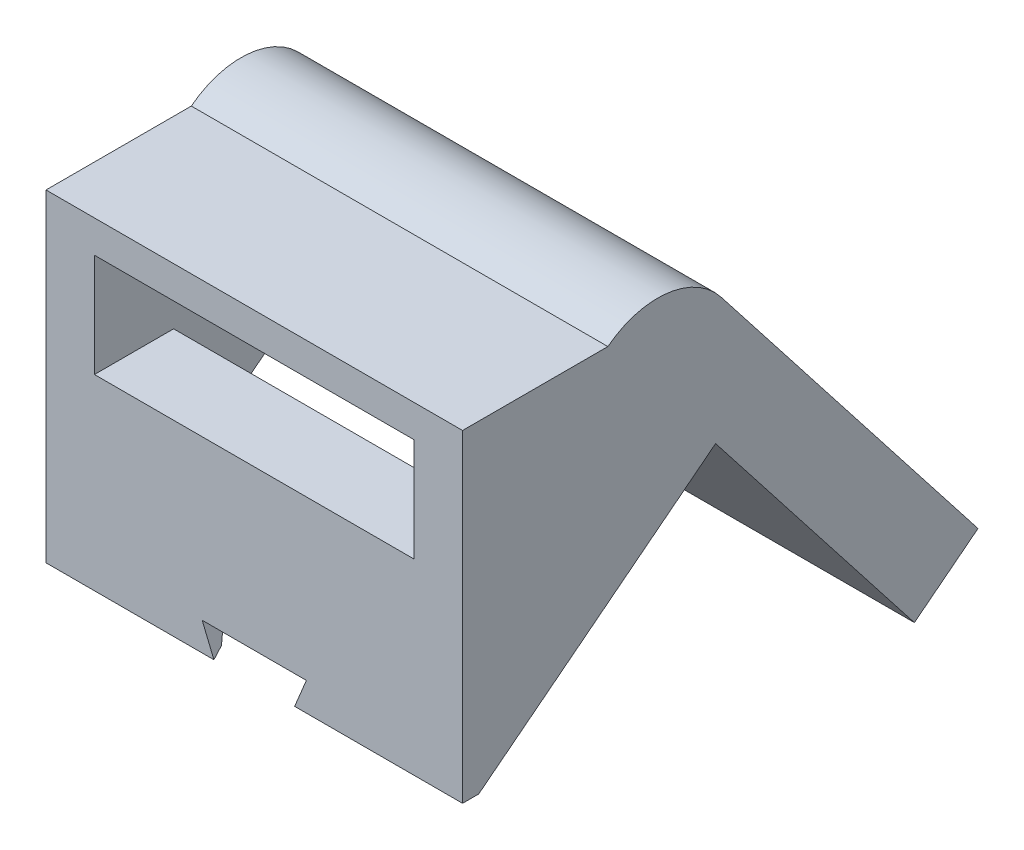
ISO-10303-21;
HEADER;
FILE_DESCRIPTION(('STEP AP214'),'2;1');
FILE_NAME('part.step','',(''),(''),'','','');
FILE_SCHEMA(('AUTOMOTIVE_DESIGN { 1 0 10303 214 1 1 1 1 }'));
ENDSEC;
DATA;
#1=APPLICATION_CONTEXT('core data for automotive mechanical design processes');
#2=APPLICATION_PROTOCOL_DEFINITION('international standard','automotive_design',2000,#1);
#3=PRODUCT_CONTEXT('',#1,'mechanical');
#4=PRODUCT('Part','Part','',(#3));
#5=PRODUCT_RELATED_PRODUCT_CATEGORY('part','',(#4));
#6=PRODUCT_DEFINITION_FORMATION('','',#4);
#7=PRODUCT_DEFINITION_CONTEXT('part definition',#1,'design');
#8=PRODUCT_DEFINITION('design','',#6,#7);
#9=PRODUCT_DEFINITION_SHAPE('','',#8);
#10=(LENGTH_UNIT() NAMED_UNIT(*) SI_UNIT(.MILLI.,.METRE.));
#11=(NAMED_UNIT(*) PLANE_ANGLE_UNIT() SI_UNIT($,.RADIAN.));
#12=(NAMED_UNIT(*) SI_UNIT($,.STERADIAN.) SOLID_ANGLE_UNIT());
#13=UNCERTAINTY_MEASURE_WITH_UNIT(LENGTH_MEASURE(1.E-05),#10,'distance_accuracy_value','');
#14=(GEOMETRIC_REPRESENTATION_CONTEXT(3) GLOBAL_UNCERTAINTY_ASSIGNED_CONTEXT((#13)) GLOBAL_UNIT_ASSIGNED_CONTEXT((#10,
#11,#12)) REPRESENTATION_CONTEXT('',''));
#15=CARTESIAN_POINT('',(0.,0.,0.));
#16=DIRECTION('',(0.,0.,1.));
#17=DIRECTION('',(1.,0.,0.));
#18=AXIS2_PLACEMENT_3D('',#15,#16,#17);
#19=CARTESIAN_POINT('',(-35.,-20.,-1.));
#20=DIRECTION('',(0.,-0.788010753606721,-0.61566147532566));
#21=DIRECTION('',(0.,0.61566147532566,-0.788010753606721));
#22=AXIS2_PLACEMENT_3D('',#19,#20,#21);
#23=PLANE('',#22);
#24=DIRECTION('',(1.,0.,0.));
#25=VECTOR('',#24,1.);
#26=CARTESIAN_POINT('',(-35.,-8.53803605089266,-15.6706448451586));
#27=LINE('',#26,#25);
#28=CARTESIAN_POINT('',(-30.4,-8.53803605089266,-15.6706448451586));
#29=VERTEX_POINT('',#28);
#30=CARTESIAN_POINT('',(-27.4,-8.53803605089265,-15.6706448451586));
#31=VERTEX_POINT('',#30);
#32=EDGE_CURVE('E198',#29,#31,#27,.T.);
#33=ORIENTED_EDGE('',*,*,#32,.T.);
#34=DIRECTION('',(0.,-0.61566147532566,0.788010753606721));
#35=VECTOR('',#34,1.);
#36=CARTESIAN_POINT('',(-27.4,-12.9043668191346,-10.0819963149601));
#37=LINE('',#36,#35);
#38=CARTESIAN_POINT('',(-27.4,-13.7095924436282,-9.05135451486218));
#39=VERTEX_POINT('',#38);
#40=EDGE_CURVE('E178',#31,#39,#37,.T.);
#41=ORIENTED_EDGE('',*,*,#40,.T.);
#42=DIRECTION('',(0.557990673424451,-0.510904963696887,0.653928533129737));
#43=VECTOR('',#42,1.);
#44=CARTESIAN_POINT('',(-27.4,-13.7095924436282,-9.05135451486218));
#45=LINE('',#44,#43);
#46=CARTESIAN_POINT('',(-20.5298597627707,-20.,-1.));
#47=VERTEX_POINT('',#46);
#48=EDGE_CURVE('E300',#39,#47,#45,.T.);
#49=ORIENTED_EDGE('',*,*,#48,.T.);
#50=DIRECTION('',(1.,0.,0.));
#51=VECTOR('',#50,1.);
#52=CARTESIAN_POINT('',(-35.,-20.,-1.));
#53=LINE('',#52,#51);
#54=CARTESIAN_POINT('',(-30.4,-20.,-1.));
#55=VERTEX_POINT('',#54);
#56=EDGE_CURVE('E213',#55,#47,#53,.T.);
#57=ORIENTED_EDGE('',*,*,#56,.F.);
#58=DIRECTION('',(0.,-0.61566147532566,0.788010753606721));
#59=VECTOR('',#58,1.);
#60=CARTESIAN_POINT('',(-30.4,-20.,-1.));
#61=LINE('',#60,#59);
#62=EDGE_CURVE('E203',#29,#55,#61,.T.);
#63=ORIENTED_EDGE('',*,*,#62,.F.);
#64=EDGE_LOOP('',(#33,#41,#49,#57,#63));
#65=FACE_BOUND('',#64,.T.);
#66=ADVANCED_FACE('F45',(#65),#23,.T.);
#67=DIRECTION('',(0.,0.61566147532566,-0.788010753606721));
#68=VECTOR('',#67,1.);
#69=CARTESIAN_POINT('',(-7.6,-12.9043668191346,-10.0819963149601));
#70=LINE('',#69,#68);
#71=CARTESIAN_POINT('',(-7.6,-13.7095924436282,-9.05135451486217));
#72=VERTEX_POINT('',#71);
#73=CARTESIAN_POINT('',(-7.6,-8.53803605089265,-15.6706448451586));
#74=VERTEX_POINT('',#73);
#75=EDGE_CURVE('E192',#72,#74,#70,.T.);
#76=ORIENTED_EDGE('',*,*,#75,.T.);
#77=CARTESIAN_POINT('',(-4.6,-8.53803605089266,-15.6706448451586));
#78=VERTEX_POINT('',#77);
#79=EDGE_CURVE('E206',#74,#78,#27,.T.);
#80=ORIENTED_EDGE('',*,*,#79,.T.);
#81=DIRECTION('',(0.,0.61566147532566,-0.788010753606721));
#82=VECTOR('',#81,1.);
#83=CARTESIAN_POINT('',(-4.6,-20.,-1.));
#84=LINE('',#83,#82);
#85=CARTESIAN_POINT('',(-4.6,-20.,-1.));
#86=VERTEX_POINT('',#85);
#87=EDGE_CURVE('E288',#86,#78,#84,.T.);
#88=ORIENTED_EDGE('',*,*,#87,.F.);
#89=CARTESIAN_POINT('',(-14.4701402372293,-20.,-1.));
#90=VERTEX_POINT('',#89);
#91=EDGE_CURVE('E218',#90,#86,#53,.T.);
#92=ORIENTED_EDGE('',*,*,#91,.F.);
#93=DIRECTION('',(0.557990673424451,0.510904963696887,-0.653928533129737));
#94=VECTOR('',#93,1.);
#95=CARTESIAN_POINT('',(-15.,-20.485147863138,-0.379039052200169));
#96=LINE('',#95,#94);
#97=EDGE_CURVE('E295',#90,#72,#96,.T.);
#98=ORIENTED_EDGE('',*,*,#97,.T.);
#99=EDGE_LOOP('',(#76,#80,#88,#92,#98));
#100=FACE_BOUND('',#99,.T.);
#101=ADVANCED_FACE('F436',(#100),#23,.T.);
#102=CARTESIAN_POINT('',(-35.,0.,0.));
#103=DIRECTION('',(0.,0.,1.));
#104=DIRECTION('',(0.,-1.,0.));
#105=AXIS2_PLACEMENT_3D('',#102,#103,#104);
#106=PLANE('',#105);
#107=DIRECTION('',(0.,-1.,0.));
#108=VECTOR('',#107,1.);
#109=CARTESIAN_POINT('',(-4.6,-24.2982511230271,0.));
#110=LINE('',#109,#108);
#111=CARTESIAN_POINT('',(-4.6,0.,0.));
#112=VERTEX_POINT('',#111);
#113=CARTESIAN_POINT('',(-4.6,-20.,0.));
#114=VERTEX_POINT('',#113);
#115=EDGE_CURVE('E259',#112,#114,#110,.T.);
#116=ORIENTED_EDGE('',*,*,#115,.F.);
#117=DIRECTION('',(1.,0.,0.));
#118=VECTOR('',#117,1.);
#119=CARTESIAN_POINT('',(-35.,0.,0.));
#120=LINE('',#119,#118);
#121=CARTESIAN_POINT('',(-30.4,0.,0.));
#122=VERTEX_POINT('',#121);
#123=EDGE_CURVE('E211',#122,#112,#120,.T.);
#124=ORIENTED_EDGE('',*,*,#123,.F.);
#125=DIRECTION('',(0.,1.,0.));
#126=VECTOR('',#125,1.);
#127=CARTESIAN_POINT('',(-30.4,-24.2982511230271,0.));
#128=LINE('',#127,#126);
#129=CARTESIAN_POINT('',(-30.4,-20.,0.));
#130=VERTEX_POINT('',#129);
#131=EDGE_CURVE('E265',#130,#122,#128,.T.);
#132=ORIENTED_EDGE('',*,*,#131,.F.);
#133=DIRECTION('',(1.,0.,0.));
#134=VECTOR('',#133,1.);
#135=CARTESIAN_POINT('',(-35.,-20.,0.));
#136=LINE('',#135,#134);
#137=CARTESIAN_POINT('',(-20.,-20.,0.));
#138=VERTEX_POINT('',#137);
#139=EDGE_CURVE('E219',#130,#138,#136,.T.);
#140=ORIENTED_EDGE('',*,*,#139,.T.);
#141=DIRECTION('',(-0.382492772013731,0.923958483567986,0.));
#142=VECTOR('',#141,1.);
#143=CARTESIAN_POINT('',(-29.2626596417517,2.37509721122787,0.));
#144=LINE('',#143,#142);
#145=CARTESIAN_POINT('',(-20.7272453217013,-18.2432491963616,0.));
#146=VERTEX_POINT('',#145);
#147=EDGE_CURVE('E326',#138,#146,#144,.T.);
#148=ORIENTED_EDGE('',*,*,#147,.T.);
#149=DIRECTION('',(1.,0.,0.));
#150=VECTOR('',#149,1.);
#151=CARTESIAN_POINT('',(-35.,-18.2432491963616,0.));
#152=LINE('',#151,#150);
#153=CARTESIAN_POINT('',(-14.2727546782987,-18.2432491963616,0.));
#154=VERTEX_POINT('',#153);
#155=EDGE_CURVE('E318',#146,#154,#152,.T.);
#156=ORIENTED_EDGE('',*,*,#155,.T.);
#157=DIRECTION('',(-0.382492772013731,-0.923958483567986,0.));
#158=VECTOR('',#157,1.);
#159=CARTESIAN_POINT('',(-10.8578655807445,-9.9941632449654,0.));
#160=LINE('',#159,#158);
#161=CARTESIAN_POINT('',(-15.,-20.,0.));
#162=VERTEX_POINT('',#161);
#163=EDGE_CURVE('E334',#154,#162,#160,.T.);
#164=ORIENTED_EDGE('',*,*,#163,.T.);
#165=EDGE_CURVE('E222',#162,#114,#136,.T.);
#166=ORIENTED_EDGE('',*,*,#165,.T.);
#167=EDGE_LOOP('',(#116,#124,#132,#140,#148,#156,#164,#166));
#168=FACE_BOUND('',#167,.T.);
#169=DIRECTION('',(1.,0.,0.));
#170=VECTOR('',#169,1.);
#171=CARTESIAN_POINT('',(0.,-8.4,0.));
#172=LINE('',#171,#170);
#173=CARTESIAN_POINT('',(-27.4,-8.4,0.));
#174=VERTEX_POINT('',#173);
#175=CARTESIAN_POINT('',(-7.6,-8.4,0.));
#176=VERTEX_POINT('',#175);
#177=EDGE_CURVE('E363',#174,#176,#172,.T.);
#178=ORIENTED_EDGE('',*,*,#177,.F.);
#179=DIRECTION('',(0.,-1.,0.));
#180=VECTOR('',#179,1.);
#181=CARTESIAN_POINT('',(-27.4,0.,0.));
#182=LINE('',#181,#180);
#183=CARTESIAN_POINT('',(-27.4,-2.,0.));
#184=VERTEX_POINT('',#183);
#185=EDGE_CURVE('E375',#184,#174,#182,.T.);
#186=ORIENTED_EDGE('',*,*,#185,.F.);
#187=DIRECTION('',(1.,0.,0.));
#188=VECTOR('',#187,1.);
#189=CARTESIAN_POINT('',(0.,-2.,0.));
#190=LINE('',#189,#188);
#191=CARTESIAN_POINT('',(-7.6,-2.,0.));
#192=VERTEX_POINT('',#191);
#193=EDGE_CURVE('E371',#184,#192,#190,.T.);
#194=ORIENTED_EDGE('',*,*,#193,.T.);
#195=DIRECTION('',(0.,1.,0.));
#196=VECTOR('',#195,1.);
#197=CARTESIAN_POINT('',(-7.6,0.,0.));
#198=LINE('',#197,#196);
#199=EDGE_CURVE('E367',#176,#192,#198,.T.);
#200=ORIENTED_EDGE('',*,*,#199,.F.);
#201=EDGE_LOOP('',(#178,#186,#194,#200));
#202=FACE_BOUND('',#201,.T.);
#203=ADVANCED_FACE('F406',(#168,#202),#106,.T.);
#204=CARTESIAN_POINT('',(-35.,-20.,0.));
#205=DIRECTION('',(0.,-1.,0.));
#206=DIRECTION('',(0.,0.,-1.));
#207=AXIS2_PLACEMENT_3D('',#204,#205,#206);
#208=PLANE('',#207);
#209=DIRECTION('',(0.,0.,-1.));
#210=VECTOR('',#209,1.);
#211=CARTESIAN_POINT('',(-4.6,-20.,0.));
#212=LINE('',#211,#210);
#213=EDGE_CURVE('E292',#114,#86,#212,.T.);
#214=ORIENTED_EDGE('',*,*,#213,.F.);
#215=ORIENTED_EDGE('',*,*,#165,.F.);
#216=DIRECTION('',(0.468196892038479,0.,-0.883624168006686));
#217=VECTOR('',#216,1.);
#218=CARTESIAN_POINT('',(-19.3841665942898,-20.,8.27420178381635));
#219=LINE('',#218,#217);
#220=EDGE_CURVE('E330',#162,#90,#219,.T.);
#221=ORIENTED_EDGE('',*,*,#220,.T.);
#222=ORIENTED_EDGE('',*,*,#91,.T.);
#223=EDGE_LOOP('',(#214,#215,#221,#222));
#224=FACE_BOUND('',#223,.T.);
#225=ADVANCED_FACE('F446',(#224),#208,.T.);
#226=DIRECTION('',(0.,0.,1.));
#227=VECTOR('',#226,1.);
#228=CARTESIAN_POINT('',(-30.4,-20.,0.));
#229=LINE('',#228,#227);
#230=EDGE_CURVE('E276',#55,#130,#229,.T.);
#231=ORIENTED_EDGE('',*,*,#230,.F.);
#232=ORIENTED_EDGE('',*,*,#56,.T.);
#233=DIRECTION('',(0.468196892038479,0.,0.883624168006686));
#234=VECTOR('',#233,1.);
#235=CARTESIAN_POINT('',(-23.2881249457174,-20.,-6.20565133786227));
#236=LINE('',#235,#234);
#237=EDGE_CURVE('E322',#47,#138,#236,.T.);
#238=ORIENTED_EDGE('',*,*,#237,.T.);
#239=ORIENTED_EDGE('',*,*,#139,.F.);
#240=EDGE_LOOP('',(#231,#232,#238,#239));
#241=FACE_BOUND('',#240,.T.);
#242=ADVANCED_FACE('F453',(#241),#208,.T.);
#243=CARTESIAN_POINT('',(0.,-6.61749566116771,-3.51040123693124));
#244=DIRECTION('',(0.,0.61566147532566,-0.788010753606721));
#245=DIRECTION('',(0.,0.788010753606721,0.61566147532566));
#246=AXIS2_PLACEMENT_3D('',#243,#244,#245);
#247=PLANE('',#246);
#248=DIRECTION('',(0.,-0.788010753606721,-0.61566147532566));
#249=VECTOR('',#248,1.);
#250=CARTESIAN_POINT('',(-7.6,-6.61749566116771,-3.51040123693124));
#251=LINE('',#250,#249);
#252=CARTESIAN_POINT('',(-7.6,-8.4,-4.90304625604677));
#253=VERTEX_POINT('',#252);
#254=CARTESIAN_POINT('',(-7.6,-12.1335709364148,-7.82003156421086));
#255=VERTEX_POINT('',#254);
#256=EDGE_CURVE('E191',#253,#255,#251,.T.);
#257=ORIENTED_EDGE('',*,*,#256,.T.);
#258=DIRECTION('',(-1.,0.,0.));
#259=VECTOR('',#258,1.);
#260=CARTESIAN_POINT('',(-7.6,-12.1335709364148,-7.82003156421086));
#261=LINE('',#260,#259);
#262=CARTESIAN_POINT('',(-27.4,-12.1335709364148,-7.82003156421086));
#263=VERTEX_POINT('',#262);
#264=EDGE_CURVE('E299',#255,#263,#261,.T.);
#265=ORIENTED_EDGE('',*,*,#264,.T.);
#266=DIRECTION('',(0.,-0.788010753606721,-0.61566147532566));
#267=VECTOR('',#266,1.);
#268=CARTESIAN_POINT('',(-27.4,-6.61749566116771,-3.51040123693124));
#269=LINE('',#268,#267);
#270=CARTESIAN_POINT('',(-27.4,-8.4,-4.90304625604677));
#271=VERTEX_POINT('',#270);
#272=EDGE_CURVE('E354',#271,#263,#269,.T.);
#273=ORIENTED_EDGE('',*,*,#272,.F.);
#274=DIRECTION('',(1.,0.,0.));
#275=VECTOR('',#274,1.);
#276=CARTESIAN_POINT('',(0.,-8.4,-4.90304625604677));
#277=LINE('',#276,#275);
#278=EDGE_CURVE('E357',#271,#253,#277,.T.);
#279=ORIENTED_EDGE('',*,*,#278,.T.);
#280=EDGE_LOOP('',(#257,#265,#273,#279));
#281=FACE_BOUND('',#280,.T.);
#282=ADVANCED_FACE('F427',(#281),#247,.T.);
#283=CARTESIAN_POINT('',(0.,-20.6042822710731,-32.7119388733122));
#284=DIRECTION('',(0.,0.788010753606721,0.61566147532566));
#285=DIRECTION('',(0.,-0.61566147532566,0.788010753606721));
#286=AXIS2_PLACEMENT_3D('',#283,#284,#285);
#287=PLANE('',#286);
#288=DIRECTION('',(1.,0.,0.));
#289=VECTOR('',#288,1.);
#290=CARTESIAN_POINT('',(-90.,-21.2199437463988,-31.9239281197054));
#291=LINE('',#290,#289);
#292=CARTESIAN_POINT('',(-30.4,-21.2199437463988,-31.9239281197054));
#293=VERTEX_POINT('',#292);
#294=CARTESIAN_POINT('',(-4.59999999999999,-21.2199437463988,-31.9239281197054));
#295=VERTEX_POINT('',#294);
#296=EDGE_CURVE('E257',#293,#295,#291,.T.);
#297=ORIENTED_EDGE('',*,*,#296,.T.);
#298=DIRECTION('',(0.,-0.61566147532566,0.788010753606721));
#299=VECTOR('',#298,1.);
#300=CARTESIAN_POINT('',(-4.6,-20.6042822710731,-32.7119388733122));
#301=LINE('',#300,#299);
#302=CARTESIAN_POINT('',(-4.6,-24.2982511230271,-27.9838743516719));
#303=VERTEX_POINT('',#302);
#304=EDGE_CURVE('E243',#295,#303,#301,.T.);
#305=ORIENTED_EDGE('',*,*,#304,.T.);
#306=DIRECTION('',(-1.,0.,0.));
#307=VECTOR('',#306,1.);
#308=CARTESIAN_POINT('',(0.,-24.2982511230271,-27.9838743516718));
#309=LINE('',#308,#307);
#310=CARTESIAN_POINT('',(-30.4,-24.2982511230271,-27.9838743516719));
#311=VERTEX_POINT('',#310);
#312=EDGE_CURVE('E348',#303,#311,#309,.T.);
#313=ORIENTED_EDGE('',*,*,#312,.T.);
#314=DIRECTION('',(0.,0.61566147532566,-0.788010753606721));
#315=VECTOR('',#314,1.);
#316=CARTESIAN_POINT('',(-30.4,-20.6042822710731,-32.7119388733122));
#317=LINE('',#316,#315);
#318=EDGE_CURVE('E263',#311,#293,#317,.T.);
#319=ORIENTED_EDGE('',*,*,#318,.T.);
#320=EDGE_LOOP('',(#297,#305,#313,#319));
#321=FACE_BOUND('',#320,.T.);
#322=ADVANCED_FACE('F448',(#321),#287,.F.);
#323=CARTESIAN_POINT('',(0.,-8.4,-8.));
#324=DIRECTION('',(0.,-1.,0.));
#325=DIRECTION('',(0.,0.,-1.));
#326=AXIS2_PLACEMENT_3D('',#323,#324,#325);
#327=PLANE('',#326);
#328=ORIENTED_EDGE('',*,*,#278,.F.);
#329=DIRECTION('',(0.,0.,1.));
#330=VECTOR('',#329,1.);
#331=CARTESIAN_POINT('',(-27.4,-8.4,-8.));
#332=LINE('',#331,#330);
#333=EDGE_CURVE('E380',#271,#174,#332,.T.);
#334=ORIENTED_EDGE('',*,*,#333,.T.);
#335=ORIENTED_EDGE('',*,*,#177,.T.);
#336=DIRECTION('',(0.,0.,1.));
#337=VECTOR('',#336,1.);
#338=CARTESIAN_POINT('',(-7.6,-8.4,-8.));
#339=LINE('',#338,#337);
#340=EDGE_CURVE('E379',#253,#176,#339,.T.);
#341=ORIENTED_EDGE('',*,*,#340,.F.);
#342=EDGE_LOOP('',(#328,#334,#335,#341));
#343=FACE_BOUND('',#342,.T.);
#344=ADVANCED_FACE('F402',(#343),#327,.F.);
#345=CARTESIAN_POINT('',(-35.,0.,0.));
#346=DIRECTION('',(0.,1.,0.));
#347=DIRECTION('',(0.,0.,1.));
#348=AXIS2_PLACEMENT_3D('',#345,#346,#347);
#349=PLANE('',#348);
#350=DIRECTION('',(0.,0.,1.));
#351=VECTOR('',#350,1.);
#352=CARTESIAN_POINT('',(-4.6,0.,0.));
#353=LINE('',#352,#351);
#354=CARTESIAN_POINT('',(-4.59999999999999,0.,-9.));
#355=VERTEX_POINT('',#354);
#356=EDGE_CURVE('E232',#355,#112,#353,.T.);
#357=ORIENTED_EDGE('',*,*,#356,.F.);
#358=DIRECTION('',(1.,0.,0.));
#359=VECTOR('',#358,1.);
#360=CARTESIAN_POINT('',(-35.,0.,-9.));
#361=LINE('',#360,#359);
#362=CARTESIAN_POINT('',(-30.4,0.,-9.));
#363=VERTEX_POINT('',#362);
#364=EDGE_CURVE('E205',#363,#355,#361,.T.);
#365=ORIENTED_EDGE('',*,*,#364,.F.);
#366=DIRECTION('',(0.,0.,-1.));
#367=VECTOR('',#366,1.);
#368=CARTESIAN_POINT('',(-30.4,0.,0.));
#369=LINE('',#368,#367);
#370=EDGE_CURVE('E251',#122,#363,#369,.T.);
#371=ORIENTED_EDGE('',*,*,#370,.F.);
#372=ORIENTED_EDGE('',*,*,#123,.T.);
#373=EDGE_LOOP('',(#357,#365,#371,#372));
#374=FACE_BOUND('',#373,.T.);
#375=ADVANCED_FACE('F239',(#374),#349,.T.);
#376=CARTESIAN_POINT('',(-27.4,0.,-8.));
#377=DIRECTION('',(-1.,0.,0.));
#378=DIRECTION('',(0.,0.,1.));
#379=AXIS2_PLACEMENT_3D('',#376,#377,#378);
#380=PLANE('',#379);
#381=DIRECTION('',(0.,-0.788010753606721,-0.615661475325659));
#382=VECTOR('',#381,1.);
#383=CARTESIAN_POINT('',(-27.4,-6.17400379007249,-13.8236604191817));
#384=LINE('',#383,#382);
#385=CARTESIAN_POINT('',(-27.4,-7.67964979315843,-15.));
#386=VERTEX_POINT('',#385);
#387=EDGE_CURVE('E182',#386,#31,#384,.T.);
#388=ORIENTED_EDGE('',*,*,#387,.F.);
#389=DIRECTION('',(0.,-1.,0.));
#390=VECTOR('',#389,1.);
#391=CARTESIAN_POINT('',(-27.4,-2.,-15.));
#392=LINE('',#391,#390);
#393=CARTESIAN_POINT('',(-27.4,-2.,-15.));
#394=VERTEX_POINT('',#393);
#395=EDGE_CURVE('E417',#394,#386,#392,.T.);
#396=ORIENTED_EDGE('',*,*,#395,.F.);
#397=DIRECTION('',(0.,0.,1.));
#398=VECTOR('',#397,1.);
#399=CARTESIAN_POINT('',(-27.4,-2.,-8.));
#400=LINE('',#399,#398);
#401=EDGE_CURVE('E383',#394,#184,#400,.T.);
#402=ORIENTED_EDGE('',*,*,#401,.T.);
#403=ORIENTED_EDGE('',*,*,#185,.T.);
#404=ORIENTED_EDGE('',*,*,#333,.F.);
#405=ORIENTED_EDGE('',*,*,#272,.T.);
#406=DIRECTION('',(0.,-0.788010753606721,-0.61566147532566));
#407=VECTOR('',#406,1.);
#408=CARTESIAN_POINT('',(-27.4,-12.1335709364148,-7.82003156421086));
#409=LINE('',#408,#407);
#410=EDGE_CURVE('E186',#263,#39,#409,.T.);
#411=ORIENTED_EDGE('',*,*,#410,.T.);
#412=ORIENTED_EDGE('',*,*,#40,.F.);
#413=EDGE_LOOP('',(#388,#396,#402,#403,#404,#405,#411,#412));
#414=FACE_BOUND('',#413,.T.);
#415=ADVANCED_FACE('F180',(#414),#380,.F.);
#416=CARTESIAN_POINT('',(0.,-2.,-8.));
#417=DIRECTION('',(0.,-1.,0.));
#418=DIRECTION('',(0.,0.,-1.));
#419=AXIS2_PLACEMENT_3D('',#416,#417,#418);
#420=PLANE('',#419);
#421=ORIENTED_EDGE('',*,*,#193,.F.);
#422=ORIENTED_EDGE('',*,*,#401,.F.);
#423=DIRECTION('',(-1.,0.,0.));
#424=VECTOR('',#423,1.);
#425=CARTESIAN_POINT('',(-27.4,-2.,-15.));
#426=LINE('',#425,#424);
#427=CARTESIAN_POINT('',(-7.6,-2.,-15.));
#428=VERTEX_POINT('',#427);
#429=EDGE_CURVE('E412',#428,#394,#426,.T.);
#430=ORIENTED_EDGE('',*,*,#429,.F.);
#431=DIRECTION('',(0.,0.,1.));
#432=VECTOR('',#431,1.);
#433=CARTESIAN_POINT('',(-7.6,-2.,-8.));
#434=LINE('',#433,#432);
#435=EDGE_CURVE('E386',#428,#192,#434,.T.);
#436=ORIENTED_EDGE('',*,*,#435,.T.);
#437=EDGE_LOOP('',(#421,#422,#430,#436));
#438=FACE_BOUND('',#437,.T.);
#439=ADVANCED_FACE('F409',(#438),#420,.T.);
#440=CARTESIAN_POINT('',(-7.6,0.,-8.));
#441=DIRECTION('',(1.,0.,0.));
#442=DIRECTION('',(0.,0.,-1.));
#443=AXIS2_PLACEMENT_3D('',#440,#441,#442);
#444=PLANE('',#443);
#445=DIRECTION('',(0.,1.,0.));
#446=VECTOR('',#445,1.);
#447=CARTESIAN_POINT('',(-7.6,-2.,-15.));
#448=LINE('',#447,#446);
#449=CARTESIAN_POINT('',(-7.6,-7.67964979315843,-15.));
#450=VERTEX_POINT('',#449);
#451=EDGE_CURVE('E413',#450,#428,#448,.T.);
#452=ORIENTED_EDGE('',*,*,#451,.F.);
#453=DIRECTION('',(0.,-0.788010753606721,-0.615661475325659));
#454=VECTOR('',#453,1.);
#455=CARTESIAN_POINT('',(-7.6,-6.17400379007249,-13.8236604191817));
#456=LINE('',#455,#454);
#457=EDGE_CURVE('E60',#450,#74,#456,.T.);
#458=ORIENTED_EDGE('',*,*,#457,.T.);
#459=ORIENTED_EDGE('',*,*,#75,.F.);
#460=DIRECTION('',(0.,-0.788010753606721,-0.61566147532566));
#461=VECTOR('',#460,1.);
#462=CARTESIAN_POINT('',(-7.6,-12.1335709364148,-7.82003156421086));
#463=LINE('',#462,#461);
#464=EDGE_CURVE('E315',#255,#72,#463,.T.);
#465=ORIENTED_EDGE('',*,*,#464,.F.);
#466=ORIENTED_EDGE('',*,*,#256,.F.);
#467=ORIENTED_EDGE('',*,*,#340,.T.);
#468=ORIENTED_EDGE('',*,*,#199,.T.);
#469=ORIENTED_EDGE('',*,*,#435,.F.);
#470=EDGE_LOOP('',(#452,#458,#459,#465,#466,#467,#468,#469));
#471=FACE_BOUND('',#470,.T.);
#472=ADVANCED_FACE('F395',(#471),#444,.F.);
#473=CARTESIAN_POINT('',(0.,4.36633076824199,-5.5886485301985));
#474=DIRECTION('',(0.,0.61566147532566,-0.788010753606721));
#475=DIRECTION('',(0.,0.788010753606721,0.61566147532566));
#476=AXIS2_PLACEMENT_3D('',#473,#474,#475);
#477=PLANE('',#476);
#478=CARTESIAN_POINT('',(-17.5,-16.4181435869599,-21.8272595984152));
#479=DIRECTION('',(0.,0.61566147532566,-0.788010753606721));
#480=DIRECTION('',(0.,0.788010753606721,0.61566147532566));
#481=AXIS2_PLACEMENT_3D('',#478,#479,#480);
#482=CIRCLE('',#481,2.6);
#483=CARTESIAN_POINT('',(-17.5,-14.3693156275824,-20.2265397625685));
#484=VERTEX_POINT('',#483);
#485=EDGE_CURVE('E344',#484,#484,#482,.T.);
#486=ORIENTED_EDGE('',*,*,#485,.T.);
#487=EDGE_LOOP('',(#486));
#488=FACE_BOUND('',#487,.T.);
#489=ORIENTED_EDGE('',*,*,#312,.F.);
#490=DIRECTION('',(0.,0.788010753606721,0.61566147532566));
#491=VECTOR('',#490,1.);
#492=CARTESIAN_POINT('',(-4.6,4.36633076824199,-5.5886485301985));
#493=LINE('',#492,#491);
#494=EDGE_CURVE('E284',#303,#78,#493,.T.);
#495=ORIENTED_EDGE('',*,*,#494,.T.);
#496=ORIENTED_EDGE('',*,*,#79,.F.);
#497=ORIENTED_EDGE('',*,*,#457,.F.);
#498=DIRECTION('',(-1.,0.,0.));
#499=VECTOR('',#498,1.);
#500=CARTESIAN_POINT('',(0.,-7.67964979315843,-15.));
#501=LINE('',#500,#499);
#502=EDGE_CURVE('E12',#450,#386,#501,.T.);
#503=ORIENTED_EDGE('',*,*,#502,.T.);
#504=ORIENTED_EDGE('',*,*,#387,.T.);
#505=ORIENTED_EDGE('',*,*,#32,.F.);
#506=DIRECTION('',(0.,-0.788010753606721,-0.61566147532566));
#507=VECTOR('',#506,1.);
#508=CARTESIAN_POINT('',(-30.4,4.36633076824199,-5.5886485301985));
#509=LINE('',#508,#507);
#510=EDGE_CURVE('E271',#29,#311,#509,.T.);
#511=ORIENTED_EDGE('',*,*,#510,.T.);
#512=EDGE_LOOP('',(#489,#495,#496,#497,#503,#504,#505,#511));
#513=FACE_BOUND('',#512,.T.);
#514=ADVANCED_FACE('F196',(#488,#513),#477,.F.);
#515=CARTESIAN_POINT('',(-17.5,-16.4181435869599,-21.8272595984152));
#516=DIRECTION('',(0.,0.61566147532566,-0.788010753606721));
#517=DIRECTION('',(0.,0.788010753606721,0.61566147532566));
#518=AXIS2_PLACEMENT_3D('',#515,#516,#517);
#519=CYLINDRICAL_SURFACE('',#518,2.6);
#520=ORIENTED_EDGE('',*,*,#485,.F.);
#521=EDGE_LOOP('',(#520));
#522=FACE_BOUND('',#521,.T.);
#523=CARTESIAN_POINT('',(-17.5,-13.3398362103316,-25.7673133664488));
#524=DIRECTION('',(0.,0.61566147532566,-0.788010753606721));
#525=DIRECTION('',(0.,0.788010753606721,0.61566147532566));
#526=AXIS2_PLACEMENT_3D('',#523,#524,#525);
#527=CIRCLE('',#526,2.6);
#528=CARTESIAN_POINT('',(-17.5,-11.2910082509541,-24.1665935306021));
#529=VERTEX_POINT('',#528);
#530=EDGE_CURVE('E338',#529,#529,#527,.T.);
#531=ORIENTED_EDGE('',*,*,#530,.T.);
#532=EDGE_LOOP('',(#531));
#533=FACE_BOUND('',#532,.T.);
#534=ADVANCED_FACE('F541',(#522,#533),#519,.F.);
#535=CARTESIAN_POINT('',(-90.,7.44463814487029,-9.5287022982321));
#536=DIRECTION('',(0.,0.61566147532566,-0.788010753606721));
#537=DIRECTION('',(0.,0.788010753606721,0.61566147532566));
#538=AXIS2_PLACEMENT_3D('',#535,#536,#537);
#539=PLANE('',#538);
#540=DIRECTION('',(0.,0.788010753606721,0.61566147532566));
#541=VECTOR('',#540,1.);
#542=CARTESIAN_POINT('',(-4.59999999999999,7.44463814487029,-9.5287022982321));
#543=LINE('',#542,#541);
#544=CARTESIAN_POINT('',(-4.59999999999999,-0.861746391405305,-16.0183611446619));
#545=VERTEX_POINT('',#544);
#546=EDGE_CURVE('E68',#295,#545,#543,.T.);
#547=ORIENTED_EDGE('',*,*,#546,.F.);
#548=ORIENTED_EDGE('',*,*,#296,.F.);
#549=DIRECTION('',(0.,-0.788010753606721,-0.61566147532566));
#550=VECTOR('',#549,1.);
#551=CARTESIAN_POINT('',(-30.4,7.44463814487029,-9.5287022982321));
#552=LINE('',#551,#550);
#553=CARTESIAN_POINT('',(-30.4,-0.861746391405305,-16.0183611446619));
#554=VERTEX_POINT('',#553);
#555=EDGE_CURVE('E249',#554,#293,#552,.T.);
#556=ORIENTED_EDGE('',*,*,#555,.F.);
#557=DIRECTION('',(1.,0.,0.));
#558=VECTOR('',#557,1.);
#559=CARTESIAN_POINT('',(0.,-0.861746391405305,-16.0183611446619));
#560=LINE('',#559,#558);
#561=EDGE_CURVE('E223',#554,#545,#560,.T.);
#562=ORIENTED_EDGE('',*,*,#561,.T.);
#563=EDGE_LOOP('',(#547,#548,#556,#562));
#564=FACE_BOUND('',#563,.T.);
#565=ORIENTED_EDGE('',*,*,#530,.F.);
#566=EDGE_LOOP('',(#565));
#567=FACE_BOUND('',#566,.T.);
#568=ADVANCED_FACE('F254',(#564,#567),#539,.T.);
#569=CARTESIAN_POINT('',(-90.,-3.9400537680336,-12.0783073766283));
#570=DIRECTION('',(-1.,0.,0.));
#571=DIRECTION('',(0.,0.,1.));
#572=AXIS2_PLACEMENT_3D('',#569,#570,#571);
#573=CYLINDRICAL_SURFACE('',#572,5.);
#574=ORIENTED_EDGE('',*,*,#364,.T.);
#575=CARTESIAN_POINT('',(-4.59999999999999,-3.9400537680336,-12.0783073766283));
#576=DIRECTION('',(-1.,0.,0.));
#577=DIRECTION('',(0.,0.,1.));
#578=AXIS2_PLACEMENT_3D('',#575,#576,#577);
#579=CIRCLE('',#578,5.);
#580=EDGE_CURVE('E54',#545,#355,#579,.F.);
#581=ORIENTED_EDGE('',*,*,#580,.F.);
#582=ORIENTED_EDGE('',*,*,#561,.F.);
#583=CARTESIAN_POINT('',(-30.4,-3.9400537680336,-12.0783073766283));
#584=DIRECTION('',(1.,0.,0.));
#585=DIRECTION('',(0.,0.,-1.));
#586=AXIS2_PLACEMENT_3D('',#583,#584,#585);
#587=CIRCLE('',#586,5.);
#588=EDGE_CURVE('E227',#363,#554,#587,.F.);
#589=ORIENTED_EDGE('',*,*,#588,.F.);
#590=EDGE_LOOP('',(#574,#581,#582,#589));
#591=FACE_BOUND('',#590,.T.);
#592=ADVANCED_FACE('F47',(#591),#573,.T.);
#593=CARTESIAN_POINT('',(-15.,-18.9091263559246,0.85228389845115));
#594=DIRECTION('',(-0.82984721989733,0.343533361218456,-0.439702651070724));
#595=DIRECTION('',(-0.468196892038479,0.,0.883624168006686));
#596=AXIS2_PLACEMENT_3D('',#593,#594,#595);
#597=PLANE('',#596);
#598=DIRECTION('',(0.557990673424451,0.510904963696887,-0.653928533129737));
#599=VECTOR('',#598,1.);
#600=CARTESIAN_POINT('',(-15.,-18.9091263559246,0.85228389845115));
#601=LINE('',#600,#599);
#602=EDGE_CURVE('E296',#154,#255,#601,.T.);
#603=ORIENTED_EDGE('',*,*,#602,.T.);
#604=ORIENTED_EDGE('',*,*,#464,.T.);
#605=ORIENTED_EDGE('',*,*,#97,.F.);
#606=ORIENTED_EDGE('',*,*,#220,.F.);
#607=ORIENTED_EDGE('',*,*,#163,.F.);
#608=EDGE_LOOP('',(#603,#604,#605,#606,#607));
#609=FACE_BOUND('',#608,.T.);
#610=ADVANCED_FACE('F433',(#609),#597,.T.);
#611=CARTESIAN_POINT('',(-27.4,-12.1335709364148,-7.82003156421086));
#612=DIRECTION('',(0.82984721989733,0.343533361218456,-0.439702651070724));
#613=DIRECTION('',(-0.468196892038479,0.,-0.883624168006686));
#614=AXIS2_PLACEMENT_3D('',#611,#612,#613);
#615=PLANE('',#614);
#616=ORIENTED_EDGE('',*,*,#237,.F.);
#617=ORIENTED_EDGE('',*,*,#48,.F.);
#618=ORIENTED_EDGE('',*,*,#410,.F.);
#619=DIRECTION('',(0.557990673424451,-0.510904963696887,0.653928533129737));
#620=VECTOR('',#619,1.);
#621=CARTESIAN_POINT('',(-27.4,-12.1335709364148,-7.82003156421086));
#622=LINE('',#621,#620);
#623=EDGE_CURVE('E304',#263,#146,#622,.T.);
#624=ORIENTED_EDGE('',*,*,#623,.T.);
#625=ORIENTED_EDGE('',*,*,#147,.F.);
#626=EDGE_LOOP('',(#616,#617,#618,#624,#625));
#627=FACE_BOUND('',#626,.T.);
#628=ADVANCED_FACE('F456',(#627),#615,.T.);
#629=CARTESIAN_POINT('',(0.,-11.3283453119212,-8.85067336430882));
#630=DIRECTION('',(0.,-0.788010753606721,-0.61566147532566));
#631=DIRECTION('',(0.,0.61566147532566,-0.788010753606721));
#632=AXIS2_PLACEMENT_3D('',#629,#630,#631);
#633=PLANE('',#632);
#634=ORIENTED_EDGE('',*,*,#623,.F.);
#635=ORIENTED_EDGE('',*,*,#264,.F.);
#636=ORIENTED_EDGE('',*,*,#602,.F.);
#637=ORIENTED_EDGE('',*,*,#155,.F.);
#638=EDGE_LOOP('',(#634,#635,#636,#637));
#639=FACE_BOUND('',#638,.T.);
#640=ADVANCED_FACE('F431',(#639),#633,.T.);
#641=CARTESIAN_POINT('',(-30.4,-24.2982511230271,-90.));
#642=DIRECTION('',(1.,0.,0.));
#643=DIRECTION('',(0.,0.,-1.));
#644=AXIS2_PLACEMENT_3D('',#641,#642,#643);
#645=PLANE('',#644);
#646=ORIENTED_EDGE('',*,*,#230,.T.);
#647=ORIENTED_EDGE('',*,*,#131,.T.);
#648=ORIENTED_EDGE('',*,*,#370,.T.);
#649=ORIENTED_EDGE('',*,*,#588,.T.);
#650=ORIENTED_EDGE('',*,*,#555,.T.);
#651=ORIENTED_EDGE('',*,*,#318,.F.);
#652=ORIENTED_EDGE('',*,*,#510,.F.);
#653=ORIENTED_EDGE('',*,*,#62,.T.);
#654=EDGE_LOOP('',(#646,#647,#648,#649,#650,#651,#652,#653));
#655=FACE_BOUND('',#654,.T.);
#656=ADVANCED_FACE('F248',(#655),#645,.F.);
#657=CARTESIAN_POINT('',(-4.6,-24.2982511230271,-90.));
#658=DIRECTION('',(-1.,0.,0.));
#659=DIRECTION('',(0.,0.,1.));
#660=AXIS2_PLACEMENT_3D('',#657,#658,#659);
#661=PLANE('',#660);
#662=ORIENTED_EDGE('',*,*,#213,.T.);
#663=ORIENTED_EDGE('',*,*,#87,.T.);
#664=ORIENTED_EDGE('',*,*,#494,.F.);
#665=ORIENTED_EDGE('',*,*,#304,.F.);
#666=ORIENTED_EDGE('',*,*,#546,.T.);
#667=ORIENTED_EDGE('',*,*,#580,.T.);
#668=ORIENTED_EDGE('',*,*,#356,.T.);
#669=ORIENTED_EDGE('',*,*,#115,.T.);
#670=EDGE_LOOP('',(#662,#663,#664,#665,#666,#667,#668,#669));
#671=FACE_BOUND('',#670,.T.);
#672=ADVANCED_FACE('F231',(#671),#661,.F.);
#673=CARTESIAN_POINT('',(0.,0.,-15.));
#674=DIRECTION('',(0.,0.,1.));
#675=DIRECTION('',(1.,0.,0.));
#676=AXIS2_PLACEMENT_3D('',#673,#674,#675);
#677=PLANE('',#676);
#678=ORIENTED_EDGE('',*,*,#502,.F.);
#679=ORIENTED_EDGE('',*,*,#451,.T.);
#680=ORIENTED_EDGE('',*,*,#429,.T.);
#681=ORIENTED_EDGE('',*,*,#395,.T.);
#682=EDGE_LOOP('',(#678,#679,#680,#681));
#683=FACE_BOUND('',#682,.T.);
#684=ADVANCED_FACE('F425',(#683),#677,.T.);
#685=CLOSED_SHELL('',(#66,#101,#203,#225,#242,#282,#322,#344,#375,#415,#439,#472,#514,#534,#568,
#592,#610,#628,#640,#656,#672,#684));
#686=MANIFOLD_SOLID_BREP('B2',#685);
#687=ADVANCED_BREP_SHAPE_REPRESENTATION('',(#18,#686),#14);
#688=SHAPE_DEFINITION_REPRESENTATION(#9,#687);
ENDSEC;
END-ISO-10303-21;
